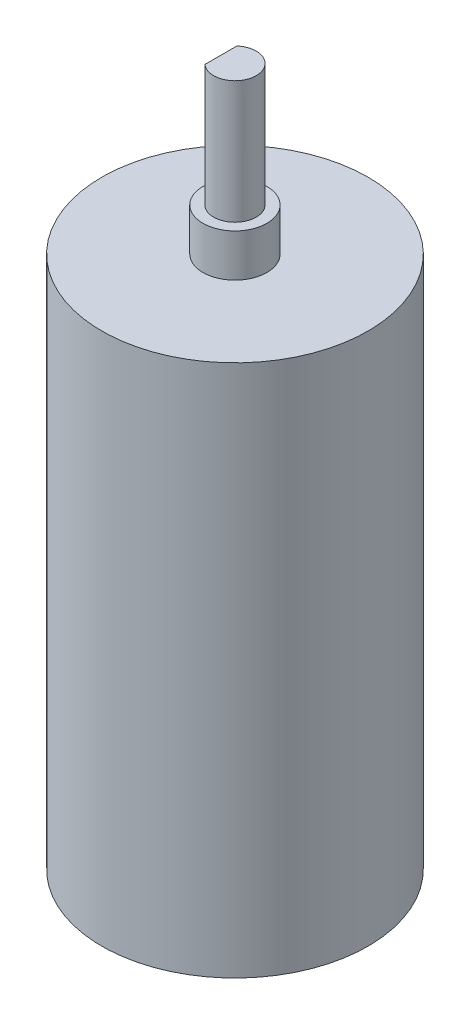
ISO-10303-21;
HEADER;
FILE_DESCRIPTION(('STEP AP214'),'2;1');
FILE_NAME('part.step','',(''),(''),'','','');
FILE_SCHEMA(('AUTOMOTIVE_DESIGN { 1 0 10303 214 1 1 1 1 }'));
ENDSEC;
DATA;
#1=APPLICATION_CONTEXT('core data for automotive mechanical design processes');
#2=APPLICATION_PROTOCOL_DEFINITION('international standard','automotive_design',2000,#1);
#3=PRODUCT_CONTEXT('',#1,'mechanical');
#4=PRODUCT('Part','Part','',(#3));
#5=PRODUCT_RELATED_PRODUCT_CATEGORY('part','',(#4));
#6=PRODUCT_DEFINITION_FORMATION('','',#4);
#7=PRODUCT_DEFINITION_CONTEXT('part definition',#1,'design');
#8=PRODUCT_DEFINITION('design','',#6,#7);
#9=PRODUCT_DEFINITION_SHAPE('','',#8);
#10=(LENGTH_UNIT() NAMED_UNIT(*) SI_UNIT(.MILLI.,.METRE.));
#11=(NAMED_UNIT(*) PLANE_ANGLE_UNIT() SI_UNIT($,.RADIAN.));
#12=(NAMED_UNIT(*) SI_UNIT($,.STERADIAN.) SOLID_ANGLE_UNIT());
#13=UNCERTAINTY_MEASURE_WITH_UNIT(LENGTH_MEASURE(1.E-05),#10,'distance_accuracy_value','');
#14=(GEOMETRIC_REPRESENTATION_CONTEXT(3) GLOBAL_UNCERTAINTY_ASSIGNED_CONTEXT((#13)) GLOBAL_UNIT_ASSIGNED_CONTEXT((#10,
#11,#12)) REPRESENTATION_CONTEXT('',''));
#15=CARTESIAN_POINT('',(0.,0.,0.));
#16=DIRECTION('',(0.,0.,1.));
#17=DIRECTION('',(1.,0.,0.));
#18=AXIS2_PLACEMENT_3D('',#15,#16,#17);
#19=CARTESIAN_POINT('',(0.,65.5,0.));
#20=DIRECTION('',(0.,-1.,0.));
#21=DIRECTION('',(0.,0.,-1.));
#22=AXIS2_PLACEMENT_3D('',#19,#20,#21);
#23=PLANE('',#22);
#24=CARTESIAN_POINT('',(0.,65.5,0.));
#25=DIRECTION('',(0.,-1.,0.));
#26=DIRECTION('',(0.,0.,-1.));
#27=AXIS2_PLACEMENT_3D('',#24,#25,#26);
#28=CIRCLE('',#27,2.);
#29=CARTESIAN_POINT('',(-1.3228756555323,65.5,-1.5));
#30=VERTEX_POINT('',#29);
#31=CARTESIAN_POINT('',(-1.3228756555323,65.5,1.5));
#32=VERTEX_POINT('',#31);
#33=EDGE_CURVE('E11',#30,#32,#28,.T.);
#34=ORIENTED_EDGE('',*,*,#33,.F.);
#35=DIRECTION('',(0.,0.,-1.));
#36=VECTOR('',#35,1.);
#37=CARTESIAN_POINT('',(-1.3228756555323,65.5,-1.5));
#38=LINE('',#37,#36);
#39=EDGE_CURVE('E74',#32,#30,#38,.T.);
#40=ORIENTED_EDGE('',*,*,#39,.F.);
#41=EDGE_LOOP('',(#34,#40));
#42=FACE_BOUND('',#41,.T.);
#43=ADVANCED_FACE('F45',(#42),#23,.F.);
#44=CARTESIAN_POINT('',(0.,0.,0.));
#45=DIRECTION('',(0.,-1.,0.));
#46=DIRECTION('',(0.,0.,-1.));
#47=AXIS2_PLACEMENT_3D('',#44,#45,#46);
#48=CYLINDRICAL_SURFACE('',#47,2.);
#49=ORIENTED_EDGE('',*,*,#33,.T.);
#50=DIRECTION('',(0.,1.,0.));
#51=VECTOR('',#50,1.);
#52=CARTESIAN_POINT('',(-1.3228756555323,55.5,1.5));
#53=LINE('',#52,#51);
#54=CARTESIAN_POINT('',(-1.3228756555323,55.5,1.5));
#55=VERTEX_POINT('',#54);
#56=EDGE_CURVE('E71',#55,#32,#53,.T.);
#57=ORIENTED_EDGE('',*,*,#56,.F.);
#58=CARTESIAN_POINT('',(0.,55.5,0.));
#59=DIRECTION('',(0.,1.,0.));
#60=DIRECTION('',(0.,0.,1.));
#61=AXIS2_PLACEMENT_3D('',#58,#59,#60);
#62=CIRCLE('',#61,2.);
#63=CARTESIAN_POINT('',(-1.32287565553229,55.5,-1.5));
#64=VERTEX_POINT('',#63);
#65=EDGE_CURVE('E64',#64,#55,#62,.T.);
#66=ORIENTED_EDGE('',*,*,#65,.F.);
#67=DIRECTION('',(0.,1.,0.));
#68=VECTOR('',#67,1.);
#69=CARTESIAN_POINT('',(-1.3228756555323,55.5,-1.5));
#70=LINE('',#69,#68);
#71=EDGE_CURVE('E78',#64,#30,#70,.T.);
#72=ORIENTED_EDGE('',*,*,#71,.T.);
#73=EDGE_LOOP('',(#49,#57,#66,#72));
#74=FACE_BOUND('',#73,.T.);
#75=CARTESIAN_POINT('',(0.,54.,0.));
#76=DIRECTION('',(0.,-1.,0.));
#77=DIRECTION('',(0.,0.,-1.));
#78=AXIS2_PLACEMENT_3D('',#75,#76,#77);
#79=CIRCLE('',#78,2.);
#80=CARTESIAN_POINT('',(0.,54.,-2.));
#81=VERTEX_POINT('',#80);
#82=EDGE_CURVE('E53',#81,#81,#79,.T.);
#83=ORIENTED_EDGE('',*,*,#82,.F.);
#84=EDGE_LOOP('',(#83));
#85=FACE_BOUND('',#84,.T.);
#86=ADVANCED_FACE('F84',(#74,#85),#48,.T.);
#87=CARTESIAN_POINT('',(-2.,54.,0.));
#88=DIRECTION('',(0.,-1.,0.));
#89=DIRECTION('',(0.,0.,-1.));
#90=AXIS2_PLACEMENT_3D('',#87,#88,#89);
#91=PLANE('',#90);
#92=CARTESIAN_POINT('',(0.,54.,0.));
#93=DIRECTION('',(0.,-1.,0.));
#94=DIRECTION('',(0.,0.,-1.));
#95=AXIS2_PLACEMENT_3D('',#92,#93,#94);
#96=CIRCLE('',#95,3.);
#97=CARTESIAN_POINT('',(0.,54.,-3.));
#98=VERTEX_POINT('',#97);
#99=EDGE_CURVE('E102',#98,#98,#96,.T.);
#100=ORIENTED_EDGE('',*,*,#99,.F.);
#101=EDGE_LOOP('',(#100));
#102=FACE_BOUND('',#101,.T.);
#103=ORIENTED_EDGE('',*,*,#82,.T.);
#104=EDGE_LOOP('',(#103));
#105=FACE_BOUND('',#104,.T.);
#106=ADVANCED_FACE('F109',(#102,#105),#91,.F.);
#107=CARTESIAN_POINT('',(0.,0.,0.));
#108=DIRECTION('',(0.,-1.,0.));
#109=DIRECTION('',(0.,0.,-1.));
#110=AXIS2_PLACEMENT_3D('',#107,#108,#109);
#111=CYLINDRICAL_SURFACE('',#110,3.);
#112=CARTESIAN_POINT('',(0.,50.,0.));
#113=DIRECTION('',(0.,-1.,0.));
#114=DIRECTION('',(0.,0.,-1.));
#115=AXIS2_PLACEMENT_3D('',#112,#113,#114);
#116=CIRCLE('',#115,3.);
#117=CARTESIAN_POINT('',(0.,50.,-3.));
#118=VERTEX_POINT('',#117);
#119=EDGE_CURVE('E98',#118,#118,#116,.T.);
#120=ORIENTED_EDGE('',*,*,#119,.F.);
#121=EDGE_LOOP('',(#120));
#122=FACE_BOUND('',#121,.T.);
#123=ORIENTED_EDGE('',*,*,#99,.T.);
#124=EDGE_LOOP('',(#123));
#125=FACE_BOUND('',#124,.T.);
#126=ADVANCED_FACE('F116',(#122,#125),#111,.T.);
#127=CARTESIAN_POINT('',(-3.,50.,0.));
#128=DIRECTION('',(0.,-1.,0.));
#129=DIRECTION('',(0.,0.,-1.));
#130=AXIS2_PLACEMENT_3D('',#127,#128,#129);
#131=PLANE('',#130);
#132=CARTESIAN_POINT('',(0.,50.,0.));
#133=DIRECTION('',(0.,-1.,0.));
#134=DIRECTION('',(0.,0.,-1.));
#135=AXIS2_PLACEMENT_3D('',#132,#133,#134);
#136=CIRCLE('',#135,12.5);
#137=CARTESIAN_POINT('',(0.,50.,-12.5));
#138=VERTEX_POINT('',#137);
#139=EDGE_CURVE('E91',#138,#138,#136,.T.);
#140=ORIENTED_EDGE('',*,*,#139,.F.);
#141=EDGE_LOOP('',(#140));
#142=FACE_BOUND('',#141,.T.);
#143=ORIENTED_EDGE('',*,*,#119,.T.);
#144=EDGE_LOOP('',(#143));
#145=FACE_BOUND('',#144,.T.);
#146=ADVANCED_FACE('F122',(#142,#145),#131,.F.);
#147=CARTESIAN_POINT('',(0.,0.,0.));
#148=DIRECTION('',(0.,-1.,0.));
#149=DIRECTION('',(0.,0.,-1.));
#150=AXIS2_PLACEMENT_3D('',#147,#148,#149);
#151=CYLINDRICAL_SURFACE('',#150,12.5);
#152=CARTESIAN_POINT('',(0.,0.,0.));
#153=DIRECTION('',(0.,-1.,0.));
#154=DIRECTION('',(0.,0.,-1.));
#155=AXIS2_PLACEMENT_3D('',#152,#153,#154);
#156=CIRCLE('',#155,12.5);
#157=CARTESIAN_POINT('',(0.,0.,-12.5));
#158=VERTEX_POINT('',#157);
#159=EDGE_CURVE('E87',#158,#158,#156,.T.);
#160=ORIENTED_EDGE('',*,*,#159,.F.);
#161=EDGE_LOOP('',(#160));
#162=FACE_BOUND('',#161,.T.);
#163=ORIENTED_EDGE('',*,*,#139,.T.);
#164=EDGE_LOOP('',(#163));
#165=FACE_BOUND('',#164,.T.);
#166=ADVANCED_FACE('F126',(#162,#165),#151,.T.);
#167=CARTESIAN_POINT('',(-12.5,0.,0.));
#168=DIRECTION('',(0.,1.,0.));
#169=DIRECTION('',(0.,0.,1.));
#170=AXIS2_PLACEMENT_3D('',#167,#168,#169);
#171=PLANE('',#170);
#172=ORIENTED_EDGE('',*,*,#159,.T.);
#173=EDGE_LOOP('',(#172));
#174=FACE_BOUND('',#173,.T.);
#175=ADVANCED_FACE('F130',(#174),#171,.F.);
#176=CARTESIAN_POINT('',(-1.3228756555323,55.5,-1.5));
#177=DIRECTION('',(1.,0.,0.));
#178=DIRECTION('',(0.,0.,-1.));
#179=AXIS2_PLACEMENT_3D('',#176,#177,#178);
#180=PLANE('',#179);
#181=ORIENTED_EDGE('',*,*,#39,.T.);
#182=ORIENTED_EDGE('',*,*,#71,.F.);
#183=DIRECTION('',(0.,0.,-1.));
#184=VECTOR('',#183,1.);
#185=CARTESIAN_POINT('',(-1.3228756555323,55.5,-1.5));
#186=LINE('',#185,#184);
#187=EDGE_CURVE('E59',#55,#64,#186,.T.);
#188=ORIENTED_EDGE('',*,*,#187,.F.);
#189=ORIENTED_EDGE('',*,*,#56,.T.);
#190=EDGE_LOOP('',(#181,#182,#188,#189));
#191=FACE_BOUND('',#190,.T.);
#192=ADVANCED_FACE('F73',(#191),#180,.F.);
#193=CARTESIAN_POINT('',(0.,55.5,0.));
#194=DIRECTION('',(0.,1.,0.));
#195=DIRECTION('',(0.,0.,1.));
#196=AXIS2_PLACEMENT_3D('',#193,#194,#195);
#197=PLANE('',#196);
#198=ORIENTED_EDGE('',*,*,#65,.T.);
#199=ORIENTED_EDGE('',*,*,#187,.T.);
#200=EDGE_LOOP('',(#198,#199));
#201=FACE_BOUND('',#200,.T.);
#202=ADVANCED_FACE('F136',(#201),#197,.T.);
#203=CLOSED_SHELL('',(#43,#86,#106,#126,#146,#166,#175,#192,#202));
#204=MANIFOLD_SOLID_BREP('B2',#203);
#205=ADVANCED_BREP_SHAPE_REPRESENTATION('',(#18,#204),#14);
#206=SHAPE_DEFINITION_REPRESENTATION(#9,#205);
ENDSEC;
END-ISO-10303-21;
